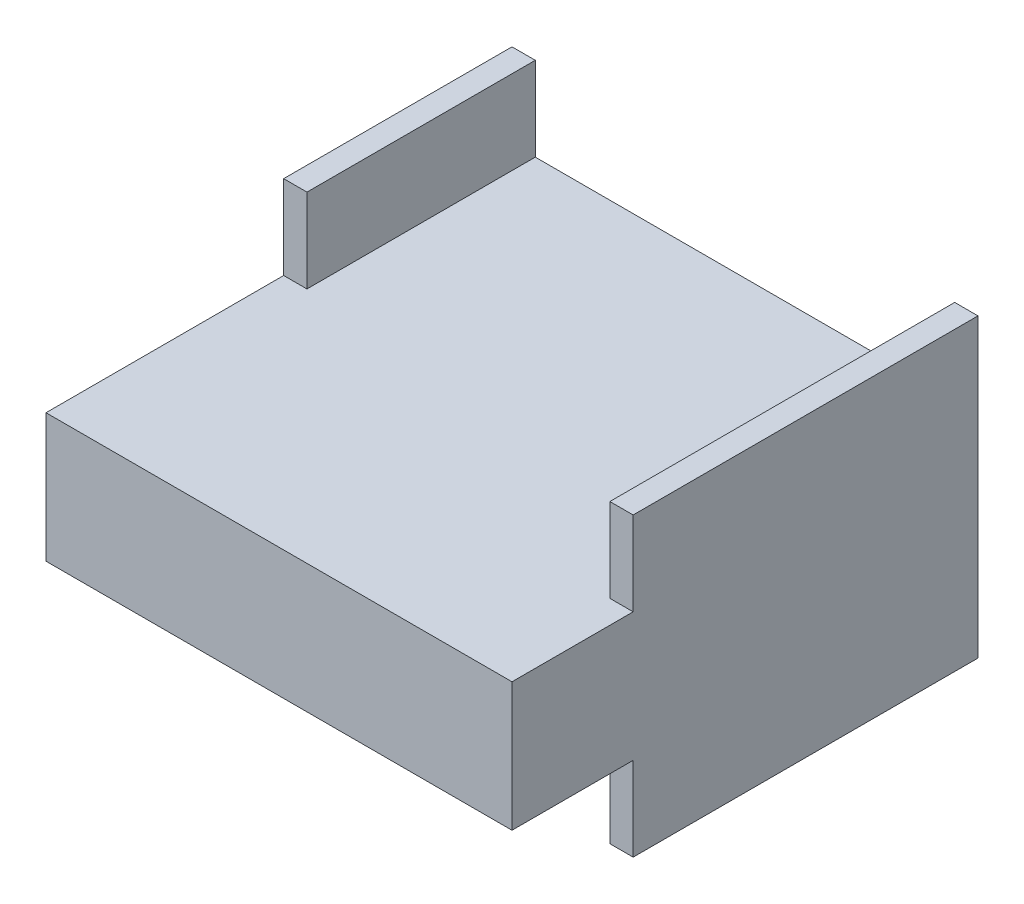
ISO-10303-21;
HEADER;
FILE_DESCRIPTION(('STEP AP214'),'2;1');
FILE_NAME('part.step','',(''),(''),'','','');
FILE_SCHEMA(('AUTOMOTIVE_DESIGN { 1 0 10303 214 1 1 1 1 }'));
ENDSEC;
DATA;
#1=APPLICATION_CONTEXT('core data for automotive mechanical design processes');
#2=APPLICATION_PROTOCOL_DEFINITION('international standard','automotive_design',2000,#1);
#3=PRODUCT_CONTEXT('',#1,'mechanical');
#4=PRODUCT('Part','Part','',(#3));
#5=PRODUCT_RELATED_PRODUCT_CATEGORY('part','',(#4));
#6=PRODUCT_DEFINITION_FORMATION('','',#4);
#7=PRODUCT_DEFINITION_CONTEXT('part definition',#1,'design');
#8=PRODUCT_DEFINITION('design','',#6,#7);
#9=PRODUCT_DEFINITION_SHAPE('','',#8);
#10=(LENGTH_UNIT() NAMED_UNIT(*) SI_UNIT(.MILLI.,.METRE.));
#11=(NAMED_UNIT(*) PLANE_ANGLE_UNIT() SI_UNIT($,.RADIAN.));
#12=(NAMED_UNIT(*) SI_UNIT($,.STERADIAN.) SOLID_ANGLE_UNIT());
#13=UNCERTAINTY_MEASURE_WITH_UNIT(LENGTH_MEASURE(1.E-05),#10,'distance_accuracy_value','');
#14=(GEOMETRIC_REPRESENTATION_CONTEXT(3) GLOBAL_UNCERTAINTY_ASSIGNED_CONTEXT((#13)) GLOBAL_UNIT_ASSIGNED_CONTEXT((#10,
#11,#12)) REPRESENTATION_CONTEXT('',''));
#15=CARTESIAN_POINT('',(0.,0.,0.));
#16=DIRECTION('',(0.,0.,1.));
#17=DIRECTION('',(1.,0.,0.));
#18=AXIS2_PLACEMENT_3D('',#15,#16,#17);
#19=CARTESIAN_POINT('',(-25.,15.9,25.));
#20=DIRECTION('',(0.,0.,-1.));
#21=DIRECTION('',(-1.,0.,0.));
#22=AXIS2_PLACEMENT_3D('',#19,#20,#21);
#23=PLANE('',#22);
#24=DIRECTION('',(0.,-1.,0.));
#25=VECTOR('',#24,1.);
#26=CARTESIAN_POINT('',(-25.,15.9,25.));
#27=LINE('',#26,#25);
#28=CARTESIAN_POINT('',(-25.,6.9,25.));
#29=VERTEX_POINT('',#28);
#30=CARTESIAN_POINT('',(-25.,-6.9,25.));
#31=VERTEX_POINT('',#30);
#32=EDGE_CURVE('E182',#29,#31,#27,.T.);
#33=ORIENTED_EDGE('',*,*,#32,.T.);
#34=DIRECTION('',(1.,0.,0.));
#35=VECTOR('',#34,1.);
#36=CARTESIAN_POINT('',(-22.5,-6.9,25.));
#37=LINE('',#36,#35);
#38=CARTESIAN_POINT('',(25.,-6.9,25.));
#39=VERTEX_POINT('',#38);
#40=EDGE_CURVE('E188',#31,#39,#37,.T.);
#41=ORIENTED_EDGE('',*,*,#40,.T.);
#42=DIRECTION('',(0.,-1.,0.));
#43=VECTOR('',#42,1.);
#44=CARTESIAN_POINT('',(25.,15.9,25.));
#45=LINE('',#44,#43);
#46=CARTESIAN_POINT('',(25.,6.9,25.));
#47=VERTEX_POINT('',#46);
#48=EDGE_CURVE('E179',#47,#39,#45,.T.);
#49=ORIENTED_EDGE('',*,*,#48,.F.);
#50=DIRECTION('',(1.,0.,0.));
#51=VECTOR('',#50,1.);
#52=CARTESIAN_POINT('',(-22.5,6.9,25.));
#53=LINE('',#52,#51);
#54=EDGE_CURVE('E190',#29,#47,#53,.T.);
#55=ORIENTED_EDGE('',*,*,#54,.F.);
#56=EDGE_LOOP('',(#33,#41,#49,#55));
#57=FACE_BOUND('',#56,.T.);
#58=ADVANCED_FACE('F33',(#57),#23,.F.);
#59=CARTESIAN_POINT('',(0.,-15.9,0.));
#60=DIRECTION('',(0.,1.,0.));
#61=DIRECTION('',(0.,0.,1.));
#62=AXIS2_PLACEMENT_3D('',#59,#60,#61);
#63=PLANE('',#62);
#64=DIRECTION('',(1.,0.,0.));
#65=VECTOR('',#64,1.);
#66=CARTESIAN_POINT('',(-25.,-15.9,-0.499999999999994));
#67=LINE('',#66,#65);
#68=CARTESIAN_POINT('',(-25.,-15.9,-0.499999999999994));
#69=VERTEX_POINT('',#68);
#70=CARTESIAN_POINT('',(-22.5,-15.9,-0.499999999999994));
#71=VERTEX_POINT('',#70);
#72=EDGE_CURVE('E150',#69,#71,#67,.T.);
#73=ORIENTED_EDGE('',*,*,#72,.F.);
#74=DIRECTION('',(0.,0.,1.));
#75=VECTOR('',#74,1.);
#76=CARTESIAN_POINT('',(-25.,-15.9,-25.));
#77=LINE('',#76,#75);
#78=CARTESIAN_POINT('',(-25.,-15.9,-25.));
#79=VERTEX_POINT('',#78);
#80=EDGE_CURVE('E162',#79,#69,#77,.T.);
#81=ORIENTED_EDGE('',*,*,#80,.F.);
#82=DIRECTION('',(-1.,0.,0.));
#83=VECTOR('',#82,1.);
#84=CARTESIAN_POINT('',(-25.,-15.9,-25.));
#85=LINE('',#84,#83);
#86=CARTESIAN_POINT('',(-22.5,-15.9,-25.));
#87=VERTEX_POINT('',#86);
#88=EDGE_CURVE('E175',#87,#79,#85,.T.);
#89=ORIENTED_EDGE('',*,*,#88,.F.);
#90=DIRECTION('',(0.,0.,1.));
#91=VECTOR('',#90,1.);
#92=CARTESIAN_POINT('',(-22.5,-15.9,-25.));
#93=LINE('',#92,#91);
#94=EDGE_CURVE('E163',#87,#71,#93,.T.);
#95=ORIENTED_EDGE('',*,*,#94,.T.);
#96=EDGE_LOOP('',(#73,#81,#89,#95));
#97=FACE_BOUND('',#96,.T.);
#98=ADVANCED_FACE('F160',(#97),#63,.F.);
#99=CARTESIAN_POINT('',(-25.,15.9,-25.));
#100=DIRECTION('',(1.,0.,0.));
#101=DIRECTION('',(0.,0.,-1.));
#102=AXIS2_PLACEMENT_3D('',#99,#100,#101);
#103=PLANE('',#102);
#104=DIRECTION('',(0.,0.,-1.));
#105=VECTOR('',#104,1.);
#106=CARTESIAN_POINT('',(-25.,-6.9,25.));
#107=LINE('',#106,#105);
#108=CARTESIAN_POINT('',(-25.,-6.9,-0.499999999999994));
#109=VERTEX_POINT('',#108);
#110=EDGE_CURVE('E155',#31,#109,#107,.T.);
#111=ORIENTED_EDGE('',*,*,#110,.F.);
#112=ORIENTED_EDGE('',*,*,#32,.F.);
#113=DIRECTION('',(0.,0.,-1.));
#114=VECTOR('',#113,1.);
#115=CARTESIAN_POINT('',(-25.,6.9,25.));
#116=LINE('',#115,#114);
#117=CARTESIAN_POINT('',(-25.,6.9,-0.499999999999994));
#118=VERTEX_POINT('',#117);
#119=EDGE_CURVE('E194',#29,#118,#116,.T.);
#120=ORIENTED_EDGE('',*,*,#119,.T.);
#121=DIRECTION('',(0.,1.,0.));
#122=VECTOR('',#121,1.);
#123=CARTESIAN_POINT('',(-25.,15.9,-0.499999999999994));
#124=LINE('',#123,#122);
#125=CARTESIAN_POINT('',(-25.,15.9,-0.499999999999994));
#126=VERTEX_POINT('',#125);
#127=EDGE_CURVE('E229',#118,#126,#124,.T.);
#128=ORIENTED_EDGE('',*,*,#127,.T.);
#129=DIRECTION('',(0.,0.,1.));
#130=VECTOR('',#129,1.);
#131=CARTESIAN_POINT('',(-25.,15.9,-25.));
#132=LINE('',#131,#130);
#133=CARTESIAN_POINT('',(-25.,15.9,-25.));
#134=VERTEX_POINT('',#133);
#135=EDGE_CURVE('E183',#134,#126,#132,.T.);
#136=ORIENTED_EDGE('',*,*,#135,.F.);
#137=DIRECTION('',(0.,-1.,0.));
#138=VECTOR('',#137,1.);
#139=CARTESIAN_POINT('',(-25.,15.9,-25.));
#140=LINE('',#139,#138);
#141=EDGE_CURVE('E41',#134,#79,#140,.T.);
#142=ORIENTED_EDGE('',*,*,#141,.T.);
#143=ORIENTED_EDGE('',*,*,#80,.T.);
#144=DIRECTION('',(0.,-1.,0.));
#145=VECTOR('',#144,1.);
#146=CARTESIAN_POINT('',(-25.,-15.9,-0.499999999999994));
#147=LINE('',#146,#145);
#148=EDGE_CURVE('E147',#109,#69,#147,.T.);
#149=ORIENTED_EDGE('',*,*,#148,.F.);
#150=EDGE_LOOP('',(#111,#112,#120,#128,#136,#142,#143,#149));
#151=FACE_BOUND('',#150,.T.);
#152=ADVANCED_FACE('F166',(#151),#103,.F.);
#153=CARTESIAN_POINT('',(-22.5,-15.9,-25.));
#154=DIRECTION('',(1.,0.,0.));
#155=DIRECTION('',(0.,0.,-1.));
#156=AXIS2_PLACEMENT_3D('',#153,#154,#155);
#157=PLANE('',#156);
#158=DIRECTION('',(0.,0.,1.));
#159=VECTOR('',#158,1.);
#160=CARTESIAN_POINT('',(-22.5,-6.9,-25.));
#161=LINE('',#160,#159);
#162=CARTESIAN_POINT('',(-22.5,-6.9,-25.));
#163=VERTEX_POINT('',#162);
#164=CARTESIAN_POINT('',(-22.5,-6.9,-0.499999999999994));
#165=VERTEX_POINT('',#164);
#166=EDGE_CURVE('E218',#163,#165,#161,.T.);
#167=ORIENTED_EDGE('',*,*,#166,.T.);
#168=DIRECTION('',(0.,-1.,0.));
#169=VECTOR('',#168,1.);
#170=CARTESIAN_POINT('',(-22.5,-15.9,-0.499999999999994));
#171=LINE('',#170,#169);
#172=EDGE_CURVE('E48',#165,#71,#171,.T.);
#173=ORIENTED_EDGE('',*,*,#172,.T.);
#174=ORIENTED_EDGE('',*,*,#94,.F.);
#175=DIRECTION('',(0.,1.,0.));
#176=VECTOR('',#175,1.);
#177=CARTESIAN_POINT('',(-22.5,-15.9,-25.));
#178=LINE('',#177,#176);
#179=EDGE_CURVE('E212',#87,#163,#178,.T.);
#180=ORIENTED_EDGE('',*,*,#179,.T.);
#181=EDGE_LOOP('',(#167,#173,#174,#180));
#182=FACE_BOUND('',#181,.T.);
#183=ADVANCED_FACE('F289',(#182),#157,.T.);
#184=DIRECTION('',(-1.,0.,0.));
#185=VECTOR('',#184,1.);
#186=CARTESIAN_POINT('',(25.,-15.9,12.));
#187=LINE('',#186,#185);
#188=CARTESIAN_POINT('',(25.,-15.9,12.));
#189=VERTEX_POINT('',#188);
#190=CARTESIAN_POINT('',(22.5,-15.9,12.));
#191=VERTEX_POINT('',#190);
#192=EDGE_CURVE('E205',#189,#191,#187,.T.);
#193=ORIENTED_EDGE('',*,*,#192,.T.);
#194=DIRECTION('',(0.,0.,1.));
#195=VECTOR('',#194,1.);
#196=CARTESIAN_POINT('',(22.5,-15.9,-25.));
#197=LINE('',#196,#195);
#198=CARTESIAN_POINT('',(22.5,-15.9,-25.));
#199=VERTEX_POINT('',#198);
#200=EDGE_CURVE('E225',#199,#191,#197,.T.);
#201=ORIENTED_EDGE('',*,*,#200,.F.);
#202=CARTESIAN_POINT('',(25.,-15.9,-25.));
#203=VERTEX_POINT('',#202);
#204=EDGE_CURVE('E170',#203,#199,#85,.T.);
#205=ORIENTED_EDGE('',*,*,#204,.F.);
#206=DIRECTION('',(0.,0.,-1.));
#207=VECTOR('',#206,1.);
#208=CARTESIAN_POINT('',(25.,-15.9,-25.));
#209=LINE('',#208,#207);
#210=EDGE_CURVE('E264',#189,#203,#209,.T.);
#211=ORIENTED_EDGE('',*,*,#210,.F.);
#212=EDGE_LOOP('',(#193,#201,#205,#211));
#213=FACE_BOUND('',#212,.T.);
#214=ADVANCED_FACE('F295',(#213),#63,.F.);
#215=CARTESIAN_POINT('',(25.,15.9,-25.));
#216=DIRECTION('',(-1.,0.,0.));
#217=DIRECTION('',(0.,0.,1.));
#218=AXIS2_PLACEMENT_3D('',#215,#216,#217);
#219=PLANE('',#218);
#220=DIRECTION('',(0.,1.,0.));
#221=VECTOR('',#220,1.);
#222=CARTESIAN_POINT('',(25.,-6.9,12.));
#223=LINE('',#222,#221);
#224=CARTESIAN_POINT('',(25.,-6.9,12.));
#225=VERTEX_POINT('',#224);
#226=EDGE_CURVE('E201',#189,#225,#223,.T.);
#227=ORIENTED_EDGE('',*,*,#226,.F.);
#228=ORIENTED_EDGE('',*,*,#210,.T.);
#229=DIRECTION('',(0.,-1.,0.));
#230=VECTOR('',#229,1.);
#231=CARTESIAN_POINT('',(25.,15.9,-25.));
#232=LINE('',#231,#230);
#233=CARTESIAN_POINT('',(25.,15.9,-25.));
#234=VERTEX_POINT('',#233);
#235=EDGE_CURVE('E11',#234,#203,#232,.T.);
#236=ORIENTED_EDGE('',*,*,#235,.F.);
#237=DIRECTION('',(0.,0.,-1.));
#238=VECTOR('',#237,1.);
#239=CARTESIAN_POINT('',(25.,15.9,-25.));
#240=LINE('',#239,#238);
#241=CARTESIAN_POINT('',(25.,15.9,12.));
#242=VERTEX_POINT('',#241);
#243=EDGE_CURVE('E169',#242,#234,#240,.T.);
#244=ORIENTED_EDGE('',*,*,#243,.F.);
#245=DIRECTION('',(0.,-1.,0.));
#246=VECTOR('',#245,1.);
#247=CARTESIAN_POINT('',(25.,6.9,12.));
#248=LINE('',#247,#246);
#249=CARTESIAN_POINT('',(25.,6.9,12.));
#250=VERTEX_POINT('',#249);
#251=EDGE_CURVE('E238',#242,#250,#248,.T.);
#252=ORIENTED_EDGE('',*,*,#251,.T.);
#253=DIRECTION('',(0.,0.,1.));
#254=VECTOR('',#253,1.);
#255=CARTESIAN_POINT('',(25.,6.9,12.));
#256=LINE('',#255,#254);
#257=EDGE_CURVE('E241',#250,#47,#256,.T.);
#258=ORIENTED_EDGE('',*,*,#257,.T.);
#259=ORIENTED_EDGE('',*,*,#48,.T.);
#260=DIRECTION('',(0.,0.,1.));
#261=VECTOR('',#260,1.);
#262=CARTESIAN_POINT('',(25.,-6.9,12.));
#263=LINE('',#262,#261);
#264=EDGE_CURVE('E203',#225,#39,#263,.T.);
#265=ORIENTED_EDGE('',*,*,#264,.F.);
#266=EDGE_LOOP('',(#227,#228,#236,#244,#252,#258,#259,#265));
#267=FACE_BOUND('',#266,.T.);
#268=ADVANCED_FACE('F35',(#267),#219,.F.);
#269=CARTESIAN_POINT('',(22.5,-15.9,-25.));
#270=DIRECTION('',(-1.,0.,0.));
#271=DIRECTION('',(0.,0.,1.));
#272=AXIS2_PLACEMENT_3D('',#269,#270,#271);
#273=PLANE('',#272);
#274=ORIENTED_EDGE('',*,*,#200,.T.);
#275=DIRECTION('',(0.,1.,0.));
#276=VECTOR('',#275,1.);
#277=CARTESIAN_POINT('',(22.5,-6.9,12.));
#278=LINE('',#277,#276);
#279=CARTESIAN_POINT('',(22.5,-6.9,12.));
#280=VERTEX_POINT('',#279);
#281=EDGE_CURVE('E199',#191,#280,#278,.T.);
#282=ORIENTED_EDGE('',*,*,#281,.T.);
#283=DIRECTION('',(0.,0.,1.));
#284=VECTOR('',#283,1.);
#285=CARTESIAN_POINT('',(22.5,-6.9,-25.));
#286=LINE('',#285,#284);
#287=CARTESIAN_POINT('',(22.5,-6.9,-25.));
#288=VERTEX_POINT('',#287);
#289=EDGE_CURVE('E222',#288,#280,#286,.T.);
#290=ORIENTED_EDGE('',*,*,#289,.F.);
#291=DIRECTION('',(0.,-1.,0.));
#292=VECTOR('',#291,1.);
#293=CARTESIAN_POINT('',(22.5,-15.9,-25.));
#294=LINE('',#293,#292);
#295=EDGE_CURVE('E56',#288,#199,#294,.T.);
#296=ORIENTED_EDGE('',*,*,#295,.T.);
#297=EDGE_LOOP('',(#274,#282,#290,#296));
#298=FACE_BOUND('',#297,.T.);
#299=ADVANCED_FACE('F292',(#298),#273,.T.);
#300=CARTESIAN_POINT('',(-25.,15.9,-25.));
#301=DIRECTION('',(0.,0.,1.));
#302=DIRECTION('',(1.,0.,0.));
#303=AXIS2_PLACEMENT_3D('',#300,#301,#302);
#304=PLANE('',#303);
#305=ORIENTED_EDGE('',*,*,#179,.F.);
#306=ORIENTED_EDGE('',*,*,#88,.T.);
#307=ORIENTED_EDGE('',*,*,#141,.F.);
#308=DIRECTION('',(-1.,0.,0.));
#309=VECTOR('',#308,1.);
#310=CARTESIAN_POINT('',(-25.,15.9,-25.));
#311=LINE('',#310,#309);
#312=CARTESIAN_POINT('',(-22.5,15.9,-25.));
#313=VERTEX_POINT('',#312);
#314=EDGE_CURVE('E172',#313,#134,#311,.T.);
#315=ORIENTED_EDGE('',*,*,#314,.F.);
#316=DIRECTION('',(0.,-1.,0.));
#317=VECTOR('',#316,1.);
#318=CARTESIAN_POINT('',(-22.5,15.9,-25.));
#319=LINE('',#318,#317);
#320=CARTESIAN_POINT('',(-22.5,6.9,-25.));
#321=VERTEX_POINT('',#320);
#322=EDGE_CURVE('E250',#313,#321,#319,.T.);
#323=ORIENTED_EDGE('',*,*,#322,.T.);
#324=DIRECTION('',(1.,0.,0.));
#325=VECTOR('',#324,1.);
#326=CARTESIAN_POINT('',(-22.5,6.9,-25.));
#327=LINE('',#326,#325);
#328=CARTESIAN_POINT('',(22.5,6.9,-25.));
#329=VERTEX_POINT('',#328);
#330=EDGE_CURVE('E253',#321,#329,#327,.T.);
#331=ORIENTED_EDGE('',*,*,#330,.T.);
#332=DIRECTION('',(0.,1.,0.));
#333=VECTOR('',#332,1.);
#334=CARTESIAN_POINT('',(22.5,15.9,-25.));
#335=LINE('',#334,#333);
#336=CARTESIAN_POINT('',(22.5,15.9,-25.));
#337=VERTEX_POINT('',#336);
#338=EDGE_CURVE('E256',#329,#337,#335,.T.);
#339=ORIENTED_EDGE('',*,*,#338,.T.);
#340=EDGE_CURVE('E273',#234,#337,#311,.T.);
#341=ORIENTED_EDGE('',*,*,#340,.F.);
#342=ORIENTED_EDGE('',*,*,#235,.T.);
#343=ORIENTED_EDGE('',*,*,#204,.T.);
#344=ORIENTED_EDGE('',*,*,#295,.F.);
#345=DIRECTION('',(1.,0.,0.));
#346=VECTOR('',#345,1.);
#347=CARTESIAN_POINT('',(-22.5,-6.9,-25.));
#348=LINE('',#347,#346);
#349=EDGE_CURVE('E215',#163,#288,#348,.T.);
#350=ORIENTED_EDGE('',*,*,#349,.F.);
#351=EDGE_LOOP('',(#305,#306,#307,#315,#323,#331,#339,#341,#342,#343,#344,#350));
#352=FACE_BOUND('',#351,.T.);
#353=ADVANCED_FACE('F284',(#352),#304,.F.);
#354=CARTESIAN_POINT('',(0.,15.9,0.));
#355=DIRECTION('',(0.,1.,0.));
#356=DIRECTION('',(0.,0.,1.));
#357=AXIS2_PLACEMENT_3D('',#354,#355,#356);
#358=PLANE('',#357);
#359=DIRECTION('',(1.,0.,0.));
#360=VECTOR('',#359,1.);
#361=CARTESIAN_POINT('',(-25.,15.9,-0.499999999999994));
#362=LINE('',#361,#360);
#363=CARTESIAN_POINT('',(-22.5,15.9,-0.499999999999994));
#364=VERTEX_POINT('',#363);
#365=EDGE_CURVE('E233',#126,#364,#362,.T.);
#366=ORIENTED_EDGE('',*,*,#365,.T.);
#367=DIRECTION('',(0.,0.,1.));
#368=VECTOR('',#367,1.);
#369=CARTESIAN_POINT('',(-22.5,15.9,-25.));
#370=LINE('',#369,#368);
#371=EDGE_CURVE('E261',#313,#364,#370,.T.);
#372=ORIENTED_EDGE('',*,*,#371,.F.);
#373=ORIENTED_EDGE('',*,*,#314,.T.);
#374=ORIENTED_EDGE('',*,*,#135,.T.);
#375=EDGE_LOOP('',(#366,#372,#373,#374));
#376=FACE_BOUND('',#375,.T.);
#377=ADVANCED_FACE('F309',(#376),#358,.T.);
#378=DIRECTION('',(-1.,0.,0.));
#379=VECTOR('',#378,1.);
#380=CARTESIAN_POINT('',(25.,15.9,12.));
#381=LINE('',#380,#379);
#382=CARTESIAN_POINT('',(22.5,15.9,12.));
#383=VERTEX_POINT('',#382);
#384=EDGE_CURVE('E246',#242,#383,#381,.T.);
#385=ORIENTED_EDGE('',*,*,#384,.F.);
#386=ORIENTED_EDGE('',*,*,#243,.T.);
#387=ORIENTED_EDGE('',*,*,#340,.T.);
#388=DIRECTION('',(0.,0.,1.));
#389=VECTOR('',#388,1.);
#390=CARTESIAN_POINT('',(22.5,15.9,-25.));
#391=LINE('',#390,#389);
#392=EDGE_CURVE('E265',#337,#383,#391,.T.);
#393=ORIENTED_EDGE('',*,*,#392,.T.);
#394=EDGE_LOOP('',(#385,#386,#387,#393));
#395=FACE_BOUND('',#394,.T.);
#396=ADVANCED_FACE('F319',(#395),#358,.T.);
#397=CARTESIAN_POINT('',(-22.5,15.9,-25.));
#398=DIRECTION('',(-1.,0.,0.));
#399=DIRECTION('',(0.,0.,1.));
#400=AXIS2_PLACEMENT_3D('',#397,#398,#399);
#401=PLANE('',#400);
#402=ORIENTED_EDGE('',*,*,#371,.T.);
#403=DIRECTION('',(0.,1.,0.));
#404=VECTOR('',#403,1.);
#405=CARTESIAN_POINT('',(-22.5,15.9,-0.499999999999994));
#406=LINE('',#405,#404);
#407=CARTESIAN_POINT('',(-22.5,6.9,-0.499999999999994));
#408=VERTEX_POINT('',#407);
#409=EDGE_CURVE('E221',#408,#364,#406,.T.);
#410=ORIENTED_EDGE('',*,*,#409,.F.);
#411=DIRECTION('',(0.,0.,1.));
#412=VECTOR('',#411,1.);
#413=CARTESIAN_POINT('',(-22.5,6.9,-25.));
#414=LINE('',#413,#412);
#415=EDGE_CURVE('E259',#321,#408,#414,.T.);
#416=ORIENTED_EDGE('',*,*,#415,.F.);
#417=ORIENTED_EDGE('',*,*,#322,.F.);
#418=EDGE_LOOP('',(#402,#410,#416,#417));
#419=FACE_BOUND('',#418,.T.);
#420=ADVANCED_FACE('F312',(#419),#401,.F.);
#421=CARTESIAN_POINT('',(22.5,15.9,-25.));
#422=DIRECTION('',(1.,0.,0.));
#423=DIRECTION('',(0.,0.,-1.));
#424=AXIS2_PLACEMENT_3D('',#421,#422,#423);
#425=PLANE('',#424);
#426=DIRECTION('',(0.,0.,1.));
#427=VECTOR('',#426,1.);
#428=CARTESIAN_POINT('',(22.5,6.9,-25.));
#429=LINE('',#428,#427);
#430=CARTESIAN_POINT('',(22.5,6.9,12.));
#431=VERTEX_POINT('',#430);
#432=EDGE_CURVE('E268',#329,#431,#429,.T.);
#433=ORIENTED_EDGE('',*,*,#432,.T.);
#434=DIRECTION('',(0.,-1.,0.));
#435=VECTOR('',#434,1.);
#436=CARTESIAN_POINT('',(22.5,6.9,12.));
#437=LINE('',#436,#435);
#438=EDGE_CURVE('E236',#383,#431,#437,.T.);
#439=ORIENTED_EDGE('',*,*,#438,.F.);
#440=ORIENTED_EDGE('',*,*,#392,.F.);
#441=ORIENTED_EDGE('',*,*,#338,.F.);
#442=EDGE_LOOP('',(#433,#439,#440,#441));
#443=FACE_BOUND('',#442,.T.);
#444=ADVANCED_FACE('F316',(#443),#425,.F.);
#445=CARTESIAN_POINT('',(-22.5,6.9,-25.));
#446=DIRECTION('',(0.,-1.,0.));
#447=DIRECTION('',(1.,0.,0.));
#448=AXIS2_PLACEMENT_3D('',#445,#446,#447);
#449=PLANE('',#448);
#450=ORIENTED_EDGE('',*,*,#54,.T.);
#451=ORIENTED_EDGE('',*,*,#257,.F.);
#452=DIRECTION('',(-1.,0.,0.));
#453=VECTOR('',#452,1.);
#454=CARTESIAN_POINT('',(25.,6.9,12.));
#455=LINE('',#454,#453);
#456=EDGE_CURVE('E244',#250,#431,#455,.T.);
#457=ORIENTED_EDGE('',*,*,#456,.T.);
#458=ORIENTED_EDGE('',*,*,#432,.F.);
#459=ORIENTED_EDGE('',*,*,#330,.F.);
#460=ORIENTED_EDGE('',*,*,#415,.T.);
#461=DIRECTION('',(1.,0.,0.));
#462=VECTOR('',#461,1.);
#463=CARTESIAN_POINT('',(-25.,6.9,-0.499999999999994));
#464=LINE('',#463,#462);
#465=EDGE_CURVE('E231',#118,#408,#464,.T.);
#466=ORIENTED_EDGE('',*,*,#465,.F.);
#467=ORIENTED_EDGE('',*,*,#119,.F.);
#468=EDGE_LOOP('',(#450,#451,#457,#458,#459,#460,#466,#467));
#469=FACE_BOUND('',#468,.T.);
#470=ADVANCED_FACE('F302',(#469),#449,.F.);
#471=CARTESIAN_POINT('',(25.,6.9,12.));
#472=DIRECTION('',(0.,0.,-1.));
#473=DIRECTION('',(0.,1.,0.));
#474=AXIS2_PLACEMENT_3D('',#471,#472,#473);
#475=PLANE('',#474);
#476=ORIENTED_EDGE('',*,*,#438,.T.);
#477=ORIENTED_EDGE('',*,*,#456,.F.);
#478=ORIENTED_EDGE('',*,*,#251,.F.);
#479=ORIENTED_EDGE('',*,*,#384,.T.);
#480=EDGE_LOOP('',(#476,#477,#478,#479));
#481=FACE_BOUND('',#480,.T.);
#482=ADVANCED_FACE('F321',(#481),#475,.F.);
#483=CARTESIAN_POINT('',(-25.,15.9,-0.499999999999994));
#484=DIRECTION('',(0.,0.,-1.));
#485=DIRECTION('',(-1.,0.,0.));
#486=AXIS2_PLACEMENT_3D('',#483,#484,#485);
#487=PLANE('',#486);
#488=ORIENTED_EDGE('',*,*,#409,.T.);
#489=ORIENTED_EDGE('',*,*,#365,.F.);
#490=ORIENTED_EDGE('',*,*,#127,.F.);
#491=ORIENTED_EDGE('',*,*,#465,.T.);
#492=EDGE_LOOP('',(#488,#489,#490,#491));
#493=FACE_BOUND('',#492,.T.);
#494=ADVANCED_FACE('F307',(#493),#487,.F.);
#495=CARTESIAN_POINT('',(-22.5,-6.9,-25.));
#496=DIRECTION('',(0.,-1.,0.));
#497=DIRECTION('',(1.,0.,0.));
#498=AXIS2_PLACEMENT_3D('',#495,#496,#497);
#499=PLANE('',#498);
#500=ORIENTED_EDGE('',*,*,#40,.F.);
#501=ORIENTED_EDGE('',*,*,#110,.T.);
#502=DIRECTION('',(1.,0.,0.));
#503=VECTOR('',#502,1.);
#504=CARTESIAN_POINT('',(-25.,-6.9,-0.499999999999994));
#505=LINE('',#504,#503);
#506=EDGE_CURVE('E151',#109,#165,#505,.T.);
#507=ORIENTED_EDGE('',*,*,#506,.T.);
#508=ORIENTED_EDGE('',*,*,#166,.F.);
#509=ORIENTED_EDGE('',*,*,#349,.T.);
#510=ORIENTED_EDGE('',*,*,#289,.T.);
#511=DIRECTION('',(-1.,0.,0.));
#512=VECTOR('',#511,1.);
#513=CARTESIAN_POINT('',(25.,-6.9,12.));
#514=LINE('',#513,#512);
#515=EDGE_CURVE('E208',#225,#280,#514,.T.);
#516=ORIENTED_EDGE('',*,*,#515,.F.);
#517=ORIENTED_EDGE('',*,*,#264,.T.);
#518=EDGE_LOOP('',(#500,#501,#507,#508,#509,#510,#516,#517));
#519=FACE_BOUND('',#518,.T.);
#520=ADVANCED_FACE('F290',(#519),#499,.T.);
#521=CARTESIAN_POINT('',(25.,-6.9,12.));
#522=DIRECTION('',(0.,0.,1.));
#523=DIRECTION('',(0.,-1.,0.));
#524=AXIS2_PLACEMENT_3D('',#521,#522,#523);
#525=PLANE('',#524);
#526=ORIENTED_EDGE('',*,*,#281,.F.);
#527=ORIENTED_EDGE('',*,*,#192,.F.);
#528=ORIENTED_EDGE('',*,*,#226,.T.);
#529=ORIENTED_EDGE('',*,*,#515,.T.);
#530=EDGE_LOOP('',(#526,#527,#528,#529));
#531=FACE_BOUND('',#530,.T.);
#532=ADVANCED_FACE('F297',(#531),#525,.T.);
#533=CARTESIAN_POINT('',(-25.,-15.9,-0.499999999999994));
#534=DIRECTION('',(0.,0.,1.));
#535=DIRECTION('',(1.,0.,0.));
#536=AXIS2_PLACEMENT_3D('',#533,#534,#535);
#537=PLANE('',#536);
#538=ORIENTED_EDGE('',*,*,#172,.F.);
#539=ORIENTED_EDGE('',*,*,#506,.F.);
#540=ORIENTED_EDGE('',*,*,#148,.T.);
#541=ORIENTED_EDGE('',*,*,#72,.T.);
#542=EDGE_LOOP('',(#538,#539,#540,#541));
#543=FACE_BOUND('',#542,.T.);
#544=ADVANCED_FACE('F149',(#543),#537,.T.);
#545=CLOSED_SHELL('',(#58,#98,#152,#183,#214,#268,#299,#353,#377,#396,#420,#444,#470,#482,#494,
#520,#532,#544));
#546=MANIFOLD_SOLID_BREP('B2',#545);
#547=ADVANCED_BREP_SHAPE_REPRESENTATION('',(#18,#546),#14);
#548=SHAPE_DEFINITION_REPRESENTATION(#9,#547);
ENDSEC;
END-ISO-10303-21;
